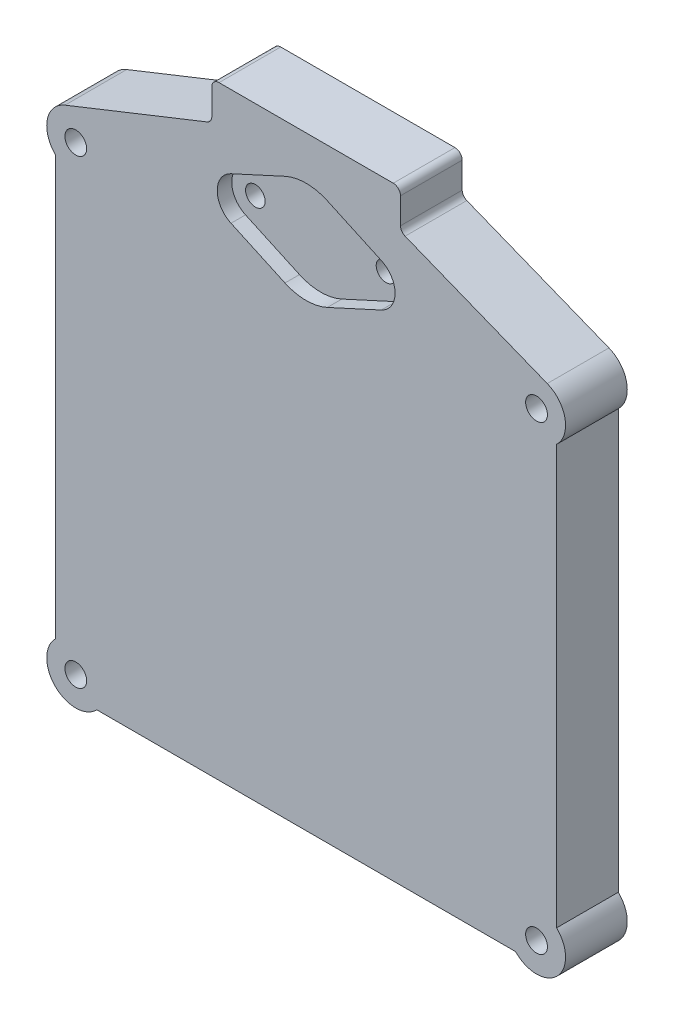
ISO-10303-21;
HEADER;
FILE_DESCRIPTION(('STEP AP214'),'2;1');
FILE_NAME('part.step','',(''),(''),'','','');
FILE_SCHEMA(('AUTOMOTIVE_DESIGN { 1 0 10303 214 1 1 1 1 }'));
ENDSEC;
DATA;
#1=APPLICATION_CONTEXT('core data for automotive mechanical design processes');
#2=APPLICATION_PROTOCOL_DEFINITION('international standard','automotive_design',2000,#1);
#3=PRODUCT_CONTEXT('',#1,'mechanical');
#4=PRODUCT('Part','Part','',(#3));
#5=PRODUCT_RELATED_PRODUCT_CATEGORY('part','',(#4));
#6=PRODUCT_DEFINITION_FORMATION('','',#4);
#7=PRODUCT_DEFINITION_CONTEXT('part definition',#1,'design');
#8=PRODUCT_DEFINITION('design','',#6,#7);
#9=PRODUCT_DEFINITION_SHAPE('','',#8);
#10=(LENGTH_UNIT() NAMED_UNIT(*) SI_UNIT(.MILLI.,.METRE.));
#11=(NAMED_UNIT(*) PLANE_ANGLE_UNIT() SI_UNIT($,.RADIAN.));
#12=(NAMED_UNIT(*) SI_UNIT($,.STERADIAN.) SOLID_ANGLE_UNIT());
#13=UNCERTAINTY_MEASURE_WITH_UNIT(LENGTH_MEASURE(1.E-05),#10,'distance_accuracy_value','');
#14=(GEOMETRIC_REPRESENTATION_CONTEXT(3) GLOBAL_UNCERTAINTY_ASSIGNED_CONTEXT((#13)) GLOBAL_UNIT_ASSIGNED_CONTEXT((#10,
#11,#12)) REPRESENTATION_CONTEXT('',''));
#15=CARTESIAN_POINT('',(0.,0.,0.));
#16=DIRECTION('',(0.,0.,1.));
#17=DIRECTION('',(1.,0.,0.));
#18=AXIS2_PLACEMENT_3D('',#15,#16,#17);
#19=CARTESIAN_POINT('',(-63.4748737341536,-63.4748737341526,17.));
#20=DIRECTION('',(0.,0.,-1.));
#21=DIRECTION('',(-1.,0.,0.));
#22=AXIS2_PLACEMENT_3D('',#19,#20,#21);
#23=CYLINDRICAL_SURFACE('',#22,8.);
#24=CARTESIAN_POINT('',(-63.4748737341536,-63.4748737341526,0.));
#25=DIRECTION('',(0.,0.,1.));
#26=DIRECTION('',(1.,0.,0.));
#27=AXIS2_PLACEMENT_3D('',#24,#25,#26);
#28=CIRCLE('',#27,8.);
#29=CARTESIAN_POINT('',(-69.0000000000019,-57.6892899480138,0.));
#30=VERTEX_POINT('',#29);
#31=CARTESIAN_POINT('',(-57.6892899480158,-69.0000000000021,0.));
#32=VERTEX_POINT('',#31);
#33=EDGE_CURVE('E358',#30,#32,#28,.T.);
#34=ORIENTED_EDGE('',*,*,#33,.T.);
#35=DIRECTION('',(0.,0.,-1.));
#36=VECTOR('',#35,1.);
#37=CARTESIAN_POINT('',(-57.6892899480158,-69.0000000000021,17.));
#38=LINE('',#37,#36);
#39=CARTESIAN_POINT('',(-57.6892899480158,-69.0000000000021,17.));
#40=VERTEX_POINT('',#39);
#41=EDGE_CURVE('E12',#40,#32,#38,.T.);
#42=ORIENTED_EDGE('',*,*,#41,.F.);
#43=CARTESIAN_POINT('',(-63.4748737341536,-63.4748737341526,17.));
#44=DIRECTION('',(0.,0.,1.));
#45=DIRECTION('',(1.,0.,0.));
#46=AXIS2_PLACEMENT_3D('',#43,#44,#45);
#47=CIRCLE('',#46,8.);
#48=CARTESIAN_POINT('',(-69.0000000000019,-57.6892899480138,17.));
#49=VERTEX_POINT('',#48);
#50=EDGE_CURVE('E307',#49,#40,#47,.T.);
#51=ORIENTED_EDGE('',*,*,#50,.F.);
#52=DIRECTION('',(0.,0.,-1.));
#53=VECTOR('',#52,1.);
#54=CARTESIAN_POINT('',(-69.0000000000019,-57.6892899480138,17.));
#55=LINE('',#54,#53);
#56=EDGE_CURVE('E205',#49,#30,#55,.T.);
#57=ORIENTED_EDGE('',*,*,#56,.T.);
#58=EDGE_LOOP('',(#34,#42,#51,#57));
#59=FACE_BOUND('',#58,.T.);
#60=ADVANCED_FACE('F48',(#59),#23,.T.);
#61=CARTESIAN_POINT('',(-57.6892899480158,-69.0000000000021,17.));
#62=DIRECTION('',(0.,1.,0.));
#63=DIRECTION('',(0.,0.,1.));
#64=AXIS2_PLACEMENT_3D('',#61,#62,#63);
#65=PLANE('',#64);
#66=DIRECTION('',(1.,0.,0.));
#67=VECTOR('',#66,1.);
#68=CARTESIAN_POINT('',(-57.6892899480158,-69.0000000000021,0.));
#69=LINE('',#68,#67);
#70=CARTESIAN_POINT('',(57.6892899480148,-69.0000000000021,0.));
#71=VERTEX_POINT('',#70);
#72=EDGE_CURVE('E349',#32,#71,#69,.T.);
#73=ORIENTED_EDGE('',*,*,#72,.T.);
#74=DIRECTION('',(0.,0.,-1.));
#75=VECTOR('',#74,1.);
#76=CARTESIAN_POINT('',(57.6892899480148,-69.0000000000021,17.));
#77=LINE('',#76,#75);
#78=CARTESIAN_POINT('',(57.6892899480148,-69.0000000000021,17.));
#79=VERTEX_POINT('',#78);
#80=EDGE_CURVE('E56',#79,#71,#77,.T.);
#81=ORIENTED_EDGE('',*,*,#80,.F.);
#82=DIRECTION('',(1.,0.,0.));
#83=VECTOR('',#82,1.);
#84=CARTESIAN_POINT('',(-57.6892899480158,-69.0000000000021,17.));
#85=LINE('',#84,#83);
#86=EDGE_CURVE('E137',#40,#79,#85,.T.);
#87=ORIENTED_EDGE('',*,*,#86,.F.);
#88=ORIENTED_EDGE('',*,*,#41,.T.);
#89=EDGE_LOOP('',(#73,#81,#87,#88));
#90=FACE_BOUND('',#89,.T.);
#91=ADVANCED_FACE('F510',(#90),#65,.F.);
#92=CARTESIAN_POINT('',(63.4748737341521,-63.4748737341521,17.));
#93=DIRECTION('',(0.,0.,-1.));
#94=DIRECTION('',(-1.,0.,0.));
#95=AXIS2_PLACEMENT_3D('',#92,#93,#94);
#96=CYLINDRICAL_SURFACE('',#95,8.);
#97=CARTESIAN_POINT('',(63.4748737341521,-63.4748737341521,0.));
#98=DIRECTION('',(0.,0.,1.));
#99=DIRECTION('',(1.,0.,0.));
#100=AXIS2_PLACEMENT_3D('',#97,#98,#99);
#101=CIRCLE('',#100,8.);
#102=CARTESIAN_POINT('',(68.9999999999982,-57.6892899480111,0.));
#103=VERTEX_POINT('',#102);
#104=EDGE_CURVE('E344',#71,#103,#101,.T.);
#105=ORIENTED_EDGE('',*,*,#104,.T.);
#106=DIRECTION('',(0.,0.,-1.));
#107=VECTOR('',#106,1.);
#108=CARTESIAN_POINT('',(68.9999999999982,-57.6892899480111,17.));
#109=LINE('',#108,#107);
#110=CARTESIAN_POINT('',(68.9999999999982,-57.6892899480111,17.));
#111=VERTEX_POINT('',#110);
#112=EDGE_CURVE('E334',#111,#103,#109,.T.);
#113=ORIENTED_EDGE('',*,*,#112,.F.);
#114=CARTESIAN_POINT('',(63.4748737341521,-63.4748737341521,17.));
#115=DIRECTION('',(0.,0.,1.));
#116=DIRECTION('',(1.,0.,0.));
#117=AXIS2_PLACEMENT_3D('',#114,#115,#116);
#118=CIRCLE('',#117,8.);
#119=EDGE_CURVE('E296',#79,#111,#118,.T.);
#120=ORIENTED_EDGE('',*,*,#119,.F.);
#121=ORIENTED_EDGE('',*,*,#80,.T.);
#122=EDGE_LOOP('',(#105,#113,#120,#121));
#123=FACE_BOUND('',#122,.T.);
#124=ADVANCED_FACE('F342',(#123),#96,.T.);
#125=CARTESIAN_POINT('',(68.9999999999982,-57.6892899480111,17.));
#126=DIRECTION('',(-1.,0.,0.));
#127=DIRECTION('',(0.,0.,1.));
#128=AXIS2_PLACEMENT_3D('',#125,#126,#127);
#129=PLANE('',#128);
#130=DIRECTION('',(0.,1.,0.));
#131=VECTOR('',#130,1.);
#132=CARTESIAN_POINT('',(68.9999999999982,-57.6892899480111,0.));
#133=LINE('',#132,#131);
#134=CARTESIAN_POINT('',(68.9999999999982,57.6892899480075,0.));
#135=VERTEX_POINT('',#134);
#136=EDGE_CURVE('E351',#103,#135,#133,.T.);
#137=ORIENTED_EDGE('',*,*,#136,.T.);
#138=DIRECTION('',(0.,0.,-1.));
#139=VECTOR('',#138,1.);
#140=CARTESIAN_POINT('',(68.9999999999982,57.6892899480075,17.));
#141=LINE('',#140,#139);
#142=CARTESIAN_POINT('',(68.9999999999982,57.6892899480075,17.));
#143=VERTEX_POINT('',#142);
#144=EDGE_CURVE('E327',#143,#135,#141,.T.);
#145=ORIENTED_EDGE('',*,*,#144,.F.);
#146=DIRECTION('',(0.,1.,0.));
#147=VECTOR('',#146,1.);
#148=CARTESIAN_POINT('',(68.9999999999982,-57.6892899480111,17.));
#149=LINE('',#148,#147);
#150=EDGE_CURVE('E291',#111,#143,#149,.T.);
#151=ORIENTED_EDGE('',*,*,#150,.F.);
#152=ORIENTED_EDGE('',*,*,#112,.T.);
#153=EDGE_LOOP('',(#137,#145,#151,#152));
#154=FACE_BOUND('',#153,.T.);
#155=ADVANCED_FACE('F700',(#154),#129,.F.);
#156=CARTESIAN_POINT('',(63.4748737341545,63.4748737341509,17.));
#157=DIRECTION('',(0.,0.,-1.));
#158=DIRECTION('',(-1.,0.,0.));
#159=AXIS2_PLACEMENT_3D('',#156,#157,#158);
#160=CYLINDRICAL_SURFACE('',#159,8.);
#161=CARTESIAN_POINT('',(63.4748737341545,63.4748737341509,0.));
#162=DIRECTION('',(0.,0.,1.));
#163=DIRECTION('',(1.,0.,0.));
#164=AXIS2_PLACEMENT_3D('',#161,#162,#163);
#165=CIRCLE('',#164,8.);
#166=CARTESIAN_POINT('',(66.4312611081222,70.9085655286124,0.));
#167=VERTEX_POINT('',#166);
#168=EDGE_CURVE('E356',#135,#167,#165,.T.);
#169=ORIENTED_EDGE('',*,*,#168,.T.);
#170=DIRECTION('',(0.,0.,-1.));
#171=VECTOR('',#170,1.);
#172=CARTESIAN_POINT('',(66.4312611081222,70.9085655286124,17.));
#173=LINE('',#172,#171);
#174=CARTESIAN_POINT('',(66.4312611081222,70.9085655286124,17.));
#175=VERTEX_POINT('',#174);
#176=EDGE_CURVE('E321',#175,#167,#173,.T.);
#177=ORIENTED_EDGE('',*,*,#176,.F.);
#178=CARTESIAN_POINT('',(63.4748737341545,63.4748737341509,17.));
#179=DIRECTION('',(0.,0.,1.));
#180=DIRECTION('',(1.,0.,0.));
#181=AXIS2_PLACEMENT_3D('',#178,#179,#180);
#182=CIRCLE('',#181,8.);
#183=EDGE_CURVE('E287',#143,#175,#182,.T.);
#184=ORIENTED_EDGE('',*,*,#183,.F.);
#185=ORIENTED_EDGE('',*,*,#144,.T.);
#186=EDGE_LOOP('',(#169,#177,#184,#185));
#187=FACE_BOUND('',#186,.T.);
#188=ADVANCED_FACE('F664',(#187),#160,.T.);
#189=CARTESIAN_POINT('',(27.2609031565084,86.4866598166083,17.));
#190=DIRECTION('',(-0.369548421746173,-0.929211474307605,0.));
#191=DIRECTION('',(0.929211474307605,-0.369548421746173,0.));
#192=AXIS2_PLACEMENT_3D('',#189,#190,#191);
#193=PLANE('',#192);
#194=DIRECTION('',(-0.929211474307605,0.369548421746173,0.));
#195=VECTOR('',#194,1.);
#196=CARTESIAN_POINT('',(27.2609031565084,86.4866598166083,0.));
#197=LINE('',#196,#195);
#198=CARTESIAN_POINT('',(27.2609031565084,86.4866598166083,0.));
#199=VERTEX_POINT('',#198);
#200=EDGE_CURVE('E226',#167,#199,#197,.T.);
#201=ORIENTED_EDGE('',*,*,#200,.T.);
#202=DIRECTION('',(0.,0.,-1.));
#203=VECTOR('',#202,1.);
#204=CARTESIAN_POINT('',(27.2609031565084,86.4866598166083,17.));
#205=LINE('',#204,#203);
#206=CARTESIAN_POINT('',(27.2609031565084,86.4866598166083,17.));
#207=VERTEX_POINT('',#206);
#208=EDGE_CURVE('E328',#207,#199,#205,.T.);
#209=ORIENTED_EDGE('',*,*,#208,.F.);
#210=DIRECTION('',(-0.929211474307605,0.369548421746173,0.));
#211=VECTOR('',#210,1.);
#212=CARTESIAN_POINT('',(27.2609031565084,86.4866598166083,17.));
#213=LINE('',#212,#211);
#214=EDGE_CURVE('E249',#175,#207,#213,.T.);
#215=ORIENTED_EDGE('',*,*,#214,.F.);
#216=ORIENTED_EDGE('',*,*,#176,.T.);
#217=EDGE_LOOP('',(#201,#209,#215,#216));
#218=FACE_BOUND('',#217,.T.);
#219=ADVANCED_FACE('F368',(#218),#193,.F.);
#220=CARTESIAN_POINT('',(28.0000000000007,88.3450827652235,17.));
#221=DIRECTION('',(0.,0.,-1.));
#222=DIRECTION('',(-1.,0.,0.));
#223=AXIS2_PLACEMENT_3D('',#220,#221,#222);
#224=CYLINDRICAL_SURFACE('',#223,2.);
#225=CARTESIAN_POINT('',(28.0000000000007,88.3450827652235,0.));
#226=DIRECTION('',(0.,0.,-1.));
#227=DIRECTION('',(1.,0.,0.));
#228=AXIS2_PLACEMENT_3D('',#225,#226,#227);
#229=CIRCLE('',#228,2.);
#230=CARTESIAN_POINT('',(26.0000000000007,88.3450827652234,0.));
#231=VERTEX_POINT('',#230);
#232=EDGE_CURVE('E220',#199,#231,#229,.T.);
#233=ORIENTED_EDGE('',*,*,#232,.T.);
#234=DIRECTION('',(0.,0.,-1.));
#235=VECTOR('',#234,1.);
#236=CARTESIAN_POINT('',(26.0000000000007,88.3450827652234,17.));
#237=LINE('',#236,#235);
#238=CARTESIAN_POINT('',(26.0000000000007,88.3450827652234,17.));
#239=VERTEX_POINT('',#238);
#240=EDGE_CURVE('E376',#239,#231,#237,.T.);
#241=ORIENTED_EDGE('',*,*,#240,.F.);
#242=CARTESIAN_POINT('',(28.0000000000007,88.3450827652235,17.));
#243=DIRECTION('',(0.,0.,-1.));
#244=DIRECTION('',(1.,0.,0.));
#245=AXIS2_PLACEMENT_3D('',#242,#243,#244);
#246=CIRCLE('',#245,2.);
#247=EDGE_CURVE('E244',#207,#239,#246,.T.);
#248=ORIENTED_EDGE('',*,*,#247,.F.);
#249=ORIENTED_EDGE('',*,*,#208,.T.);
#250=EDGE_LOOP('',(#233,#241,#248,#249));
#251=FACE_BOUND('',#250,.T.);
#252=ADVANCED_FACE('F372',(#251),#224,.F.);
#253=CARTESIAN_POINT('',(26.0000000000007,88.3450827652234,17.));
#254=DIRECTION('',(-1.,0.,0.));
#255=DIRECTION('',(0.,0.,1.));
#256=AXIS2_PLACEMENT_3D('',#253,#254,#255);
#257=PLANE('',#256);
#258=DIRECTION('',(0.,1.,0.));
#259=VECTOR('',#258,1.);
#260=CARTESIAN_POINT('',(26.0000000000007,88.3450827652234,0.));
#261=LINE('',#260,#259);
#262=CARTESIAN_POINT('',(26.0000000000007,95.4999999999998,0.));
#263=VERTEX_POINT('',#262);
#264=EDGE_CURVE('E225',#231,#263,#261,.T.);
#265=ORIENTED_EDGE('',*,*,#264,.T.);
#266=DIRECTION('',(0.,0.,-1.));
#267=VECTOR('',#266,1.);
#268=CARTESIAN_POINT('',(26.0000000000007,95.4999999999998,17.));
#269=LINE('',#268,#267);
#270=CARTESIAN_POINT('',(26.0000000000007,95.4999999999998,17.));
#271=VERTEX_POINT('',#270);
#272=EDGE_CURVE('E385',#271,#263,#269,.T.);
#273=ORIENTED_EDGE('',*,*,#272,.F.);
#274=DIRECTION('',(0.,1.,0.));
#275=VECTOR('',#274,1.);
#276=CARTESIAN_POINT('',(26.0000000000007,88.3450827652234,17.));
#277=LINE('',#276,#275);
#278=EDGE_CURVE('E248',#239,#271,#277,.T.);
#279=ORIENTED_EDGE('',*,*,#278,.F.);
#280=ORIENTED_EDGE('',*,*,#240,.T.);
#281=EDGE_LOOP('',(#265,#273,#279,#280));
#282=FACE_BOUND('',#281,.T.);
#283=ADVANCED_FACE('F383',(#282),#257,.F.);
#284=CARTESIAN_POINT('',(24.0000000000007,95.4999999999998,17.));
#285=DIRECTION('',(0.,0.,-1.));
#286=DIRECTION('',(-1.,0.,0.));
#287=AXIS2_PLACEMENT_3D('',#284,#285,#286);
#288=CYLINDRICAL_SURFACE('',#287,2.);
#289=CARTESIAN_POINT('',(24.0000000000007,95.4999999999998,0.));
#290=DIRECTION('',(0.,0.,1.));
#291=DIRECTION('',(1.,0.,0.));
#292=AXIS2_PLACEMENT_3D('',#289,#290,#291);
#293=CIRCLE('',#292,2.);
#294=CARTESIAN_POINT('',(24.0000000000005,97.4999999999998,0.));
#295=VERTEX_POINT('',#294);
#296=EDGE_CURVE('E232',#263,#295,#293,.T.);
#297=ORIENTED_EDGE('',*,*,#296,.T.);
#298=DIRECTION('',(0.,0.,-1.));
#299=VECTOR('',#298,1.);
#300=CARTESIAN_POINT('',(24.0000000000005,97.4999999999998,17.));
#301=LINE('',#300,#299);
#302=CARTESIAN_POINT('',(24.0000000000005,97.4999999999998,17.));
#303=VERTEX_POINT('',#302);
#304=EDGE_CURVE('E391',#303,#295,#301,.T.);
#305=ORIENTED_EDGE('',*,*,#304,.F.);
#306=CARTESIAN_POINT('',(24.0000000000007,95.4999999999998,17.));
#307=DIRECTION('',(0.,0.,1.));
#308=DIRECTION('',(1.,0.,0.));
#309=AXIS2_PLACEMENT_3D('',#306,#307,#308);
#310=CIRCLE('',#309,2.);
#311=EDGE_CURVE('E255',#271,#303,#310,.T.);
#312=ORIENTED_EDGE('',*,*,#311,.F.);
#313=ORIENTED_EDGE('',*,*,#272,.T.);
#314=EDGE_LOOP('',(#297,#305,#312,#313));
#315=FACE_BOUND('',#314,.T.);
#316=ADVANCED_FACE('F388',(#315),#288,.T.);
#317=CARTESIAN_POINT('',(-23.9999999999995,97.4999999999998,17.));
#318=DIRECTION('',(0.,-1.,0.));
#319=DIRECTION('',(0.,0.,-1.));
#320=AXIS2_PLACEMENT_3D('',#317,#318,#319);
#321=PLANE('',#320);
#322=DIRECTION('',(-1.,0.,0.));
#323=VECTOR('',#322,1.);
#324=CARTESIAN_POINT('',(-23.9999999999995,97.4999999999998,0.));
#325=LINE('',#324,#323);
#326=CARTESIAN_POINT('',(-23.9999999999995,97.4999999999998,0.));
#327=VERTEX_POINT('',#326);
#328=EDGE_CURVE('E413',#295,#327,#325,.T.);
#329=ORIENTED_EDGE('',*,*,#328,.T.);
#330=DIRECTION('',(0.,0.,-1.));
#331=VECTOR('',#330,1.);
#332=CARTESIAN_POINT('',(-23.9999999999995,97.4999999999998,17.));
#333=LINE('',#332,#331);
#334=CARTESIAN_POINT('',(-23.9999999999995,97.4999999999998,17.));
#335=VERTEX_POINT('',#334);
#336=EDGE_CURVE('E394',#335,#327,#333,.T.);
#337=ORIENTED_EDGE('',*,*,#336,.F.);
#338=DIRECTION('',(-1.,0.,0.));
#339=VECTOR('',#338,1.);
#340=CARTESIAN_POINT('',(-23.9999999999995,97.4999999999998,17.));
#341=LINE('',#340,#339);
#342=EDGE_CURVE('E259',#303,#335,#341,.T.);
#343=ORIENTED_EDGE('',*,*,#342,.F.);
#344=ORIENTED_EDGE('',*,*,#304,.T.);
#345=EDGE_LOOP('',(#329,#337,#343,#344));
#346=FACE_BOUND('',#345,.T.);
#347=ADVANCED_FACE('F677',(#346),#321,.F.);
#348=CARTESIAN_POINT('',(-23.9999999999993,95.4999999999998,17.));
#349=DIRECTION('',(0.,0.,-1.));
#350=DIRECTION('',(-1.,0.,0.));
#351=AXIS2_PLACEMENT_3D('',#348,#349,#350);
#352=CYLINDRICAL_SURFACE('',#351,2.);
#353=CARTESIAN_POINT('',(-23.9999999999993,95.4999999999998,0.));
#354=DIRECTION('',(0.,0.,1.));
#355=DIRECTION('',(1.,0.,0.));
#356=AXIS2_PLACEMENT_3D('',#353,#354,#355);
#357=CIRCLE('',#356,2.);
#358=CARTESIAN_POINT('',(-25.9999999999993,95.4999999999998,0.));
#359=VERTEX_POINT('',#358);
#360=EDGE_CURVE('E408',#327,#359,#357,.T.);
#361=ORIENTED_EDGE('',*,*,#360,.T.);
#362=DIRECTION('',(0.,0.,-1.));
#363=VECTOR('',#362,1.);
#364=CARTESIAN_POINT('',(-25.9999999999993,95.4999999999998,17.));
#365=LINE('',#364,#363);
#366=CARTESIAN_POINT('',(-25.9999999999993,95.4999999999998,17.));
#367=VERTEX_POINT('',#366);
#368=EDGE_CURVE('E534',#367,#359,#365,.T.);
#369=ORIENTED_EDGE('',*,*,#368,.F.);
#370=CARTESIAN_POINT('',(-23.9999999999993,95.4999999999998,17.));
#371=DIRECTION('',(0.,0.,1.));
#372=DIRECTION('',(1.,0.,0.));
#373=AXIS2_PLACEMENT_3D('',#370,#371,#372);
#374=CIRCLE('',#373,2.);
#375=EDGE_CURVE('E269',#335,#367,#374,.T.);
#376=ORIENTED_EDGE('',*,*,#375,.F.);
#377=ORIENTED_EDGE('',*,*,#336,.T.);
#378=EDGE_LOOP('',(#361,#369,#376,#377));
#379=FACE_BOUND('',#378,.T.);
#380=ADVANCED_FACE('F545',(#379),#352,.T.);
#381=CARTESIAN_POINT('',(-25.9999999999996,88.3450827652236,17.));
#382=DIRECTION('',(1.,0.,0.));
#383=DIRECTION('',(0.,1.,0.));
#384=AXIS2_PLACEMENT_3D('',#381,#382,#383);
#385=PLANE('',#384);
#386=DIRECTION('',(0.,-1.,0.));
#387=VECTOR('',#386,1.);
#388=CARTESIAN_POINT('',(-25.9999999999996,88.3450827652236,0.));
#389=LINE('',#388,#387);
#390=CARTESIAN_POINT('',(-25.9999999999996,88.3450827652236,0.));
#391=VERTEX_POINT('',#390);
#392=EDGE_CURVE('E412',#359,#391,#389,.T.);
#393=ORIENTED_EDGE('',*,*,#392,.T.);
#394=DIRECTION('',(0.,0.,-1.));
#395=VECTOR('',#394,1.);
#396=CARTESIAN_POINT('',(-25.9999999999996,88.3450827652236,17.));
#397=LINE('',#396,#395);
#398=CARTESIAN_POINT('',(-25.9999999999996,88.3450827652236,17.));
#399=VERTEX_POINT('',#398);
#400=EDGE_CURVE('E530',#399,#391,#397,.T.);
#401=ORIENTED_EDGE('',*,*,#400,.F.);
#402=DIRECTION('',(0.,-1.,0.));
#403=VECTOR('',#402,1.);
#404=CARTESIAN_POINT('',(-25.9999999999996,88.3450827652236,17.));
#405=LINE('',#404,#403);
#406=EDGE_CURVE('E272',#367,#399,#405,.T.);
#407=ORIENTED_EDGE('',*,*,#406,.F.);
#408=ORIENTED_EDGE('',*,*,#368,.T.);
#409=EDGE_LOOP('',(#393,#401,#407,#408));
#410=FACE_BOUND('',#409,.T.);
#411=ADVANCED_FACE('F553',(#410),#385,.F.);
#412=CARTESIAN_POINT('',(-27.9999999999995,88.3450827652234,17.));
#413=DIRECTION('',(0.,0.,-1.));
#414=DIRECTION('',(-1.,0.,0.));
#415=AXIS2_PLACEMENT_3D('',#412,#413,#414);
#416=CYLINDRICAL_SURFACE('',#415,1.99999999999999);
#417=CARTESIAN_POINT('',(-27.9999999999995,88.3450827652234,0.));
#418=DIRECTION('',(0.,0.,-1.));
#419=DIRECTION('',(1.,0.,0.));
#420=AXIS2_PLACEMENT_3D('',#417,#418,#419);
#421=CIRCLE('',#420,1.99999999999999);
#422=CARTESIAN_POINT('',(-27.2609031565071,86.4866598166083,0.));
#423=VERTEX_POINT('',#422);
#424=EDGE_CURVE('E417',#391,#423,#421,.T.);
#425=ORIENTED_EDGE('',*,*,#424,.T.);
#426=DIRECTION('',(0.,0.,-1.));
#427=VECTOR('',#426,1.);
#428=CARTESIAN_POINT('',(-27.2609031565071,86.4866598166083,17.));
#429=LINE('',#428,#427);
#430=CARTESIAN_POINT('',(-27.2609031565071,86.4866598166083,17.));
#431=VERTEX_POINT('',#430);
#432=EDGE_CURVE('E198',#431,#423,#429,.T.);
#433=ORIENTED_EDGE('',*,*,#432,.F.);
#434=CARTESIAN_POINT('',(-27.9999999999995,88.3450827652234,17.));
#435=DIRECTION('',(0.,0.,-1.));
#436=DIRECTION('',(1.,0.,0.));
#437=AXIS2_PLACEMENT_3D('',#434,#435,#436);
#438=CIRCLE('',#437,1.99999999999999);
#439=EDGE_CURVE('E184',#399,#431,#438,.T.);
#440=ORIENTED_EDGE('',*,*,#439,.F.);
#441=ORIENTED_EDGE('',*,*,#400,.T.);
#442=EDGE_LOOP('',(#425,#433,#440,#441));
#443=FACE_BOUND('',#442,.T.);
#444=ADVANCED_FACE('F556',(#443),#416,.F.);
#445=CARTESIAN_POINT('',(-27.2609031565071,86.4866598166083,17.));
#446=DIRECTION('',(0.369548421746161,-0.92921147430761,0.));
#447=DIRECTION('',(0.92921147430761,0.369548421746161,0.));
#448=AXIS2_PLACEMENT_3D('',#445,#446,#447);
#449=PLANE('',#448);
#450=DIRECTION('',(-0.92921147430761,-0.369548421746161,0.));
#451=VECTOR('',#450,1.);
#452=CARTESIAN_POINT('',(-27.2609031565071,86.4866598166083,0.));
#453=LINE('',#452,#451);
#454=CARTESIAN_POINT('',(-66.4312611081239,70.9085655286118,0.));
#455=VERTEX_POINT('',#454);
#456=EDGE_CURVE('E194',#423,#455,#453,.T.);
#457=ORIENTED_EDGE('',*,*,#456,.T.);
#458=DIRECTION('',(0.,0.,-1.));
#459=VECTOR('',#458,1.);
#460=CARTESIAN_POINT('',(-66.4312611081239,70.9085655286118,17.));
#461=LINE('',#460,#459);
#462=CARTESIAN_POINT('',(-66.4312611081239,70.9085655286118,17.));
#463=VERTEX_POINT('',#462);
#464=EDGE_CURVE('E191',#463,#455,#461,.T.);
#465=ORIENTED_EDGE('',*,*,#464,.F.);
#466=DIRECTION('',(-0.92921147430761,-0.369548421746161,0.));
#467=VECTOR('',#466,1.);
#468=CARTESIAN_POINT('',(-27.2609031565071,86.4866598166083,17.));
#469=LINE('',#468,#467);
#470=EDGE_CURVE('E177',#431,#463,#469,.T.);
#471=ORIENTED_EDGE('',*,*,#470,.F.);
#472=ORIENTED_EDGE('',*,*,#432,.T.);
#473=EDGE_LOOP('',(#457,#465,#471,#472));
#474=FACE_BOUND('',#473,.T.);
#475=ADVANCED_FACE('F192',(#474),#449,.F.);
#476=CARTESIAN_POINT('',(-63.4748737341545,63.474873734151,17.));
#477=DIRECTION('',(0.,0.,-1.));
#478=DIRECTION('',(-1.,0.,0.));
#479=AXIS2_PLACEMENT_3D('',#476,#477,#478);
#480=CYLINDRICAL_SURFACE('',#479,8.);
#481=CARTESIAN_POINT('',(-63.4748737341545,63.474873734151,0.));
#482=DIRECTION('',(0.,0.,1.));
#483=DIRECTION('',(1.,0.,0.));
#484=AXIS2_PLACEMENT_3D('',#481,#482,#483);
#485=CIRCLE('',#484,8.);
#486=CARTESIAN_POINT('',(-69.0000000000019,57.6892899480113,0.));
#487=VERTEX_POINT('',#486);
#488=EDGE_CURVE('E517',#455,#487,#485,.T.);
#489=ORIENTED_EDGE('',*,*,#488,.T.);
#490=DIRECTION('',(0.,0.,-1.));
#491=VECTOR('',#490,1.);
#492=CARTESIAN_POINT('',(-69.0000000000019,57.6892899480113,17.));
#493=LINE('',#492,#491);
#494=CARTESIAN_POINT('',(-69.0000000000019,57.6892899480113,17.));
#495=VERTEX_POINT('',#494);
#496=EDGE_CURVE('E199',#495,#487,#493,.T.);
#497=ORIENTED_EDGE('',*,*,#496,.F.);
#498=CARTESIAN_POINT('',(-63.4748737341545,63.474873734151,17.));
#499=DIRECTION('',(0.,0.,1.));
#500=DIRECTION('',(1.,0.,0.));
#501=AXIS2_PLACEMENT_3D('',#498,#499,#500);
#502=CIRCLE('',#501,8.);
#503=EDGE_CURVE('E181',#463,#495,#502,.T.);
#504=ORIENTED_EDGE('',*,*,#503,.F.);
#505=ORIENTED_EDGE('',*,*,#464,.T.);
#506=EDGE_LOOP('',(#489,#497,#504,#505));
#507=FACE_BOUND('',#506,.T.);
#508=ADVANCED_FACE('F201',(#507),#480,.T.);
#509=CARTESIAN_POINT('',(-69.0000000000019,57.6892899480113,17.));
#510=DIRECTION('',(1.,0.,0.));
#511=DIRECTION('',(0.,0.,-1.));
#512=AXIS2_PLACEMENT_3D('',#509,#510,#511);
#513=PLANE('',#512);
#514=DIRECTION('',(0.,-1.,0.));
#515=VECTOR('',#514,1.);
#516=CARTESIAN_POINT('',(-69.0000000000019,57.6892899480113,0.));
#517=LINE('',#516,#515);
#518=EDGE_CURVE('E129',#487,#30,#517,.T.);
#519=ORIENTED_EDGE('',*,*,#518,.T.);
#520=ORIENTED_EDGE('',*,*,#56,.F.);
#521=DIRECTION('',(0.,-1.,0.));
#522=VECTOR('',#521,1.);
#523=CARTESIAN_POINT('',(-69.0000000000019,57.6892899480113,17.));
#524=LINE('',#523,#522);
#525=EDGE_CURVE('E72',#495,#49,#524,.T.);
#526=ORIENTED_EDGE('',*,*,#525,.F.);
#527=ORIENTED_EDGE('',*,*,#496,.T.);
#528=EDGE_LOOP('',(#519,#520,#526,#527));
#529=FACE_BOUND('',#528,.T.);
#530=ADVANCED_FACE('F497',(#529),#513,.F.);
#531=CARTESIAN_POINT('',(-63.4748737341536,-63.4748737341526,17.));
#532=DIRECTION('',(0.,0.,1.));
#533=DIRECTION('',(1.,0.,0.));
#534=AXIS2_PLACEMENT_3D('',#531,#532,#533);
#535=PLANE('',#534);
#536=DIRECTION('',(0.909059342886304,-0.416666666666678,0.));
#537=VECTOR('',#536,1.);
#538=CARTESIAN_POINT('',(-20.7083333333336,65.5911142712389,17.));
#539=LINE('',#538,#537);
#540=CARTESIAN_POINT('',(-20.7083333333336,65.5911142712389,17.));
#541=VERTEX_POINT('',#540);
#542=CARTESIAN_POINT('',(-5.83333333333313,58.773169199591,17.));
#543=VERTEX_POINT('',#542);
#544=EDGE_CURVE('E63',#541,#543,#539,.T.);
#545=ORIENTED_EDGE('',*,*,#544,.F.);
#546=CARTESIAN_POINT('',(-17.9999999999998,71.4999999999997,17.));
#547=DIRECTION('',(0.,0.,1.));
#548=DIRECTION('',(1.,0.,0.));
#549=AXIS2_PLACEMENT_3D('',#546,#547,#548);
#550=CIRCLE('',#549,6.5);
#551=CARTESIAN_POINT('',(-20.7083333333336,77.4088857287605,17.));
#552=VERTEX_POINT('',#551);
#553=EDGE_CURVE('E775',#552,#541,#550,.T.);
#554=ORIENTED_EDGE('',*,*,#553,.F.);
#555=DIRECTION('',(-0.909059342886312,-0.416666666666661,0.));
#556=VECTOR('',#555,1.);
#557=CARTESIAN_POINT('',(-20.7083333333336,77.4088857287605,17.));
#558=LINE('',#557,#556);
#559=CARTESIAN_POINT('',(-5.83333333333414,84.2268308004074,17.));
#560=VERTEX_POINT('',#559);
#561=EDGE_CURVE('E779',#560,#552,#558,.T.);
#562=ORIENTED_EDGE('',*,*,#561,.F.);
#563=CARTESIAN_POINT('',(0.,71.4999999999995,17.));
#564=DIRECTION('',(0.,0.,1.));
#565=DIRECTION('',(1.,0.,0.));
#566=AXIS2_PLACEMENT_3D('',#563,#564,#565);
#567=CIRCLE('',#566,13.9999999999999);
#568=CARTESIAN_POINT('',(5.83333333333346,84.2268308004079,17.));
#569=VERTEX_POINT('',#568);
#570=EDGE_CURVE('E783',#569,#560,#567,.T.);
#571=ORIENTED_EDGE('',*,*,#570,.F.);
#572=DIRECTION('',(-0.909059342886314,0.416666666666656,0.));
#573=VECTOR('',#572,1.);
#574=CARTESIAN_POINT('',(20.7083333333343,77.4088857287605,17.));
#575=LINE('',#574,#573);
#576=CARTESIAN_POINT('',(20.7083333333343,77.4088857287605,17.));
#577=VERTEX_POINT('',#576);
#578=EDGE_CURVE('E787',#577,#569,#575,.T.);
#579=ORIENTED_EDGE('',*,*,#578,.F.);
#580=CARTESIAN_POINT('',(18.0000000000005,71.4999999999997,17.));
#581=DIRECTION('',(0.,0.,1.));
#582=DIRECTION('',(1.,0.,0.));
#583=AXIS2_PLACEMENT_3D('',#580,#581,#582);
#584=CIRCLE('',#583,6.5);
#585=CARTESIAN_POINT('',(20.7083333333343,65.5911142712389,17.));
#586=VERTEX_POINT('',#585);
#587=EDGE_CURVE('E791',#586,#577,#584,.T.);
#588=ORIENTED_EDGE('',*,*,#587,.F.);
#589=DIRECTION('',(0.909059342886307,0.416666666666673,0.));
#590=VECTOR('',#589,1.);
#591=CARTESIAN_POINT('',(20.7083333333343,65.5911142712389,17.));
#592=LINE('',#591,#590);
#593=CARTESIAN_POINT('',(5.83333333333499,58.7731691995918,17.));
#594=VERTEX_POINT('',#593);
#595=EDGE_CURVE('E771',#594,#586,#592,.T.);
#596=ORIENTED_EDGE('',*,*,#595,.F.);
#597=CARTESIAN_POINT('',(0.,71.4999999999995,17.));
#598=DIRECTION('',(0.,0.,1.));
#599=DIRECTION('',(1.,0.,0.));
#600=AXIS2_PLACEMENT_3D('',#597,#598,#599);
#601=CIRCLE('',#600,14.0000000000001);
#602=EDGE_CURVE('E766',#543,#594,#601,.T.);
#603=ORIENTED_EDGE('',*,*,#602,.F.);
#604=EDGE_LOOP('',(#545,#554,#562,#571,#579,#588,#596,#603));
#605=FACE_BOUND('',#604,.T.);
#606=CARTESIAN_POINT('',(63.4748737341527,63.4748737341516,17.));
#607=DIRECTION('',(0.,0.,1.));
#608=DIRECTION('',(1.,0.,0.));
#609=AXIS2_PLACEMENT_3D('',#606,#607,#608);
#610=CIRCLE('',#609,3.00000000000001);
#611=CARTESIAN_POINT('',(66.4748737341527,63.4748737341516,17.));
#612=VERTEX_POINT('',#611);
#613=EDGE_CURVE('E464',#612,#612,#610,.T.);
#614=ORIENTED_EDGE('',*,*,#613,.F.);
#615=EDGE_LOOP('',(#614));
#616=FACE_BOUND('',#615,.T.);
#617=CARTESIAN_POINT('',(-63.474873734152,-63.4748737341541,17.));
#618=DIRECTION('',(0.,0.,1.));
#619=DIRECTION('',(1.,0.,0.));
#620=AXIS2_PLACEMENT_3D('',#617,#618,#619);
#621=CIRCLE('',#620,3.);
#622=CARTESIAN_POINT('',(-60.474873734152,-63.4748737341541,17.));
#623=VERTEX_POINT('',#622);
#624=EDGE_CURVE('E448',#623,#623,#621,.T.);
#625=ORIENTED_EDGE('',*,*,#624,.F.);
#626=EDGE_LOOP('',(#625));
#627=FACE_BOUND('',#626,.T.);
#628=CARTESIAN_POINT('',(63.4748737341552,-63.4748737341491,17.));
#629=DIRECTION('',(0.,0.,1.));
#630=DIRECTION('',(1.,0.,0.));
#631=AXIS2_PLACEMENT_3D('',#628,#629,#630);
#632=CIRCLE('',#631,3.00000000000001);
#633=CARTESIAN_POINT('',(66.4748737341552,-63.4748737341491,17.));
#634=VERTEX_POINT('',#633);
#635=EDGE_CURVE('E449',#634,#634,#632,.T.);
#636=ORIENTED_EDGE('',*,*,#635,.F.);
#637=EDGE_LOOP('',(#636));
#638=FACE_BOUND('',#637,.T.);
#639=CARTESIAN_POINT('',(-63.4748737341545,63.4748737341509,17.));
#640=DIRECTION('',(0.,0.,1.));
#641=DIRECTION('',(1.,0.,0.));
#642=AXIS2_PLACEMENT_3D('',#639,#640,#641);
#643=CIRCLE('',#642,3.);
#644=CARTESIAN_POINT('',(-60.4748737341545,63.4748737341509,17.));
#645=VERTEX_POINT('',#644);
#646=EDGE_CURVE('E311',#645,#645,#643,.T.);
#647=ORIENTED_EDGE('',*,*,#646,.F.);
#648=EDGE_LOOP('',(#647));
#649=FACE_BOUND('',#648,.T.);
#650=ORIENTED_EDGE('',*,*,#50,.T.);
#651=ORIENTED_EDGE('',*,*,#86,.T.);
#652=ORIENTED_EDGE('',*,*,#119,.T.);
#653=ORIENTED_EDGE('',*,*,#150,.T.);
#654=ORIENTED_EDGE('',*,*,#183,.T.);
#655=ORIENTED_EDGE('',*,*,#214,.T.);
#656=ORIENTED_EDGE('',*,*,#247,.T.);
#657=ORIENTED_EDGE('',*,*,#278,.T.);
#658=ORIENTED_EDGE('',*,*,#311,.T.);
#659=ORIENTED_EDGE('',*,*,#342,.T.);
#660=ORIENTED_EDGE('',*,*,#375,.T.);
#661=ORIENTED_EDGE('',*,*,#406,.T.);
#662=ORIENTED_EDGE('',*,*,#439,.T.);
#663=ORIENTED_EDGE('',*,*,#470,.T.);
#664=ORIENTED_EDGE('',*,*,#503,.T.);
#665=ORIENTED_EDGE('',*,*,#525,.T.);
#666=EDGE_LOOP('',(#650,#651,#652,#653,#654,#655,#656,#657,#658,#659,#660,#661,#662,#663,#664,#665));
#667=FACE_BOUND('',#666,.T.);
#668=ADVANCED_FACE('F179',(#605,#616,#627,#638,#649,#667),#535,.T.);
#669=CARTESIAN_POINT('',(-63.4748737341536,-63.4748737341526,0.));
#670=DIRECTION('',(0.,0.,1.));
#671=DIRECTION('',(1.,0.,0.));
#672=AXIS2_PLACEMENT_3D('',#669,#670,#671);
#673=PLANE('',#672);
#674=CARTESIAN_POINT('',(-17.9999999999998,71.4999999999997,0.));
#675=DIRECTION('',(0.,0.,1.));
#676=DIRECTION('',(1.,0.,0.));
#677=AXIS2_PLACEMENT_3D('',#674,#675,#676);
#678=CIRCLE('',#677,2.7);
#679=CARTESIAN_POINT('',(-15.2999999999998,71.4999999999997,0.));
#680=VERTEX_POINT('',#679);
#681=EDGE_CURVE('E763',#680,#680,#678,.T.);
#682=ORIENTED_EDGE('',*,*,#681,.T.);
#683=EDGE_LOOP('',(#682));
#684=FACE_BOUND('',#683,.T.);
#685=CARTESIAN_POINT('',(18.0000000000005,71.4999999999997,0.));
#686=DIRECTION('',(0.,0.,1.));
#687=DIRECTION('',(1.,0.,0.));
#688=AXIS2_PLACEMENT_3D('',#685,#686,#687);
#689=CIRCLE('',#688,2.7);
#690=CARTESIAN_POINT('',(20.7000000000005,71.4999999999997,0.));
#691=VERTEX_POINT('',#690);
#692=EDGE_CURVE('E760',#691,#691,#689,.T.);
#693=ORIENTED_EDGE('',*,*,#692,.T.);
#694=EDGE_LOOP('',(#693));
#695=FACE_BOUND('',#694,.T.);
#696=ORIENTED_EDGE('',*,*,#33,.F.);
#697=ORIENTED_EDGE('',*,*,#518,.F.);
#698=ORIENTED_EDGE('',*,*,#488,.F.);
#699=ORIENTED_EDGE('',*,*,#456,.F.);
#700=ORIENTED_EDGE('',*,*,#424,.F.);
#701=ORIENTED_EDGE('',*,*,#392,.F.);
#702=ORIENTED_EDGE('',*,*,#360,.F.);
#703=ORIENTED_EDGE('',*,*,#328,.F.);
#704=ORIENTED_EDGE('',*,*,#296,.F.);
#705=ORIENTED_EDGE('',*,*,#264,.F.);
#706=ORIENTED_EDGE('',*,*,#232,.F.);
#707=ORIENTED_EDGE('',*,*,#200,.F.);
#708=ORIENTED_EDGE('',*,*,#168,.F.);
#709=ORIENTED_EDGE('',*,*,#136,.F.);
#710=ORIENTED_EDGE('',*,*,#104,.F.);
#711=ORIENTED_EDGE('',*,*,#72,.F.);
#712=EDGE_LOOP('',(#696,#697,#698,#699,#700,#701,#702,#703,#704,#705,#706,#707,#708,#709,#710,#711));
#713=FACE_BOUND('',#712,.T.);
#714=ADVANCED_FACE('F348',(#684,#695,#713),#673,.F.);
#715=CARTESIAN_POINT('',(-63.4748737341545,63.4748737341509,7.));
#716=DIRECTION('',(0.,0.,1.));
#717=DIRECTION('',(1.,0.,0.));
#718=AXIS2_PLACEMENT_3D('',#715,#716,#717);
#719=CYLINDRICAL_SURFACE('',#718,3.);
#720=CARTESIAN_POINT('',(-63.4748737341545,63.4748737341509,7.));
#721=DIRECTION('',(0.,0.,1.));
#722=DIRECTION('',(1.,0.,0.));
#723=AXIS2_PLACEMENT_3D('',#720,#721,#722);
#724=CIRCLE('',#723,3.);
#725=CARTESIAN_POINT('',(-60.4748737341545,63.4748737341509,7.));
#726=VERTEX_POINT('',#725);
#727=EDGE_CURVE('E479',#726,#726,#724,.T.);
#728=ORIENTED_EDGE('',*,*,#727,.F.);
#729=EDGE_LOOP('',(#728));
#730=FACE_BOUND('',#729,.T.);
#731=ORIENTED_EDGE('',*,*,#646,.T.);
#732=EDGE_LOOP('',(#731));
#733=FACE_BOUND('',#732,.T.);
#734=ADVANCED_FACE('F494',(#730,#733),#719,.F.);
#735=CARTESIAN_POINT('',(-63.4748737341545,63.4748737341509,7.));
#736=DIRECTION('',(0.,0.,1.));
#737=DIRECTION('',(1.,0.,0.));
#738=AXIS2_PLACEMENT_3D('',#735,#736,#737);
#739=PLANE('',#738);
#740=ORIENTED_EDGE('',*,*,#727,.T.);
#741=EDGE_LOOP('',(#740));
#742=FACE_BOUND('',#741,.T.);
#743=ADVANCED_FACE('F965',(#742),#739,.T.);
#744=CARTESIAN_POINT('',(63.4748737341552,-63.4748737341491,7.));
#745=DIRECTION('',(0.,0.,1.));
#746=DIRECTION('',(1.,0.,0.));
#747=AXIS2_PLACEMENT_3D('',#744,#745,#746);
#748=CYLINDRICAL_SURFACE('',#747,3.00000000000001);
#749=CARTESIAN_POINT('',(63.4748737341552,-63.4748737341491,7.));
#750=DIRECTION('',(0.,0.,1.));
#751=DIRECTION('',(1.,0.,0.));
#752=AXIS2_PLACEMENT_3D('',#749,#750,#751);
#753=CIRCLE('',#752,3.00000000000001);
#754=CARTESIAN_POINT('',(66.4748737341552,-63.4748737341491,7.));
#755=VERTEX_POINT('',#754);
#756=EDGE_CURVE('E443',#755,#755,#753,.T.);
#757=ORIENTED_EDGE('',*,*,#756,.F.);
#758=EDGE_LOOP('',(#757));
#759=FACE_BOUND('',#758,.T.);
#760=ORIENTED_EDGE('',*,*,#635,.T.);
#761=EDGE_LOOP('',(#760));
#762=FACE_BOUND('',#761,.T.);
#763=ADVANCED_FACE('F961',(#759,#762),#748,.F.);
#764=CARTESIAN_POINT('',(63.4748737341552,-63.4748737341491,7.));
#765=DIRECTION('',(0.,0.,1.));
#766=DIRECTION('',(1.,0.,0.));
#767=AXIS2_PLACEMENT_3D('',#764,#765,#766);
#768=PLANE('',#767);
#769=ORIENTED_EDGE('',*,*,#756,.T.);
#770=EDGE_LOOP('',(#769));
#771=FACE_BOUND('',#770,.T.);
#772=ADVANCED_FACE('F957',(#771),#768,.T.);
#773=CARTESIAN_POINT('',(-63.474873734152,-63.4748737341541,7.));
#774=DIRECTION('',(0.,0.,1.));
#775=DIRECTION('',(1.,0.,0.));
#776=AXIS2_PLACEMENT_3D('',#773,#774,#775);
#777=CYLINDRICAL_SURFACE('',#776,3.);
#778=CARTESIAN_POINT('',(-63.474873734152,-63.4748737341541,7.));
#779=DIRECTION('',(0.,0.,1.));
#780=DIRECTION('',(1.,0.,0.));
#781=AXIS2_PLACEMENT_3D('',#778,#779,#780);
#782=CIRCLE('',#781,3.);
#783=CARTESIAN_POINT('',(-60.474873734152,-63.4748737341541,7.));
#784=VERTEX_POINT('',#783);
#785=EDGE_CURVE('E469',#784,#784,#782,.T.);
#786=ORIENTED_EDGE('',*,*,#785,.F.);
#787=EDGE_LOOP('',(#786));
#788=FACE_BOUND('',#787,.T.);
#789=ORIENTED_EDGE('',*,*,#624,.T.);
#790=EDGE_LOOP('',(#789));
#791=FACE_BOUND('',#790,.T.);
#792=ADVANCED_FACE('F960',(#788,#791),#777,.F.);
#793=CARTESIAN_POINT('',(-63.474873734152,-63.4748737341541,7.));
#794=DIRECTION('',(0.,0.,1.));
#795=DIRECTION('',(1.,0.,0.));
#796=AXIS2_PLACEMENT_3D('',#793,#794,#795);
#797=PLANE('',#796);
#798=ORIENTED_EDGE('',*,*,#785,.T.);
#799=EDGE_LOOP('',(#798));
#800=FACE_BOUND('',#799,.T.);
#801=ADVANCED_FACE('F973',(#800),#797,.T.);
#802=CARTESIAN_POINT('',(63.4748737341527,63.4748737341516,7.));
#803=DIRECTION('',(0.,0.,1.));
#804=DIRECTION('',(1.,0.,0.));
#805=AXIS2_PLACEMENT_3D('',#802,#803,#804);
#806=CYLINDRICAL_SURFACE('',#805,3.00000000000001);
#807=CARTESIAN_POINT('',(63.4748737341527,63.4748737341516,7.));
#808=DIRECTION('',(0.,0.,1.));
#809=DIRECTION('',(1.,0.,0.));
#810=AXIS2_PLACEMENT_3D('',#807,#808,#809);
#811=CIRCLE('',#810,3.00000000000001);
#812=CARTESIAN_POINT('',(66.4748737341527,63.4748737341516,7.));
#813=VERTEX_POINT('',#812);
#814=EDGE_CURVE('E460',#813,#813,#811,.T.);
#815=ORIENTED_EDGE('',*,*,#814,.F.);
#816=EDGE_LOOP('',(#815));
#817=FACE_BOUND('',#816,.T.);
#818=ORIENTED_EDGE('',*,*,#613,.T.);
#819=EDGE_LOOP('',(#818));
#820=FACE_BOUND('',#819,.T.);
#821=ADVANCED_FACE('F969',(#817,#820),#806,.F.);
#822=CARTESIAN_POINT('',(63.4748737341527,63.4748737341516,7.));
#823=DIRECTION('',(0.,0.,1.));
#824=DIRECTION('',(1.,0.,0.));
#825=AXIS2_PLACEMENT_3D('',#822,#823,#824);
#826=PLANE('',#825);
#827=ORIENTED_EDGE('',*,*,#814,.T.);
#828=EDGE_LOOP('',(#827));
#829=FACE_BOUND('',#828,.T.);
#830=ADVANCED_FACE('F636',(#829),#826,.T.);
#831=CARTESIAN_POINT('',(-20.7083333333336,65.5911142712389,13.));
#832=DIRECTION('',(-0.416666666666678,-0.909059342886304,0.));
#833=DIRECTION('',(0.909059342886304,-0.416666666666678,0.));
#834=AXIS2_PLACEMENT_3D('',#831,#832,#833);
#835=PLANE('',#834);
#836=ORIENTED_EDGE('',*,*,#544,.T.);
#837=DIRECTION('',(0.,0.,1.));
#838=VECTOR('',#837,1.);
#839=CARTESIAN_POINT('',(-5.83333333333309,58.7731691995911,13.));
#840=LINE('',#839,#838);
#841=CARTESIAN_POINT('',(-5.83333333333309,58.7731691995911,13.));
#842=VERTEX_POINT('',#841);
#843=EDGE_CURVE('E749',#842,#543,#840,.T.);
#844=ORIENTED_EDGE('',*,*,#843,.F.);
#845=DIRECTION('',(0.909059342886304,-0.416666666666678,0.));
#846=VECTOR('',#845,1.);
#847=CARTESIAN_POINT('',(-20.7083333333336,65.5911142712389,13.));
#848=LINE('',#847,#846);
#849=CARTESIAN_POINT('',(-20.7083333333336,65.5911142712389,13.));
#850=VERTEX_POINT('',#849);
#851=EDGE_CURVE('E442',#850,#842,#848,.T.);
#852=ORIENTED_EDGE('',*,*,#851,.F.);
#853=DIRECTION('',(0.,0.,1.));
#854=VECTOR('',#853,1.);
#855=CARTESIAN_POINT('',(-20.7083333333336,65.5911142712389,13.));
#856=LINE('',#855,#854);
#857=EDGE_CURVE('E923',#850,#541,#856,.T.);
#858=ORIENTED_EDGE('',*,*,#857,.T.);
#859=EDGE_LOOP('',(#836,#844,#852,#858));
#860=FACE_BOUND('',#859,.T.);
#861=ADVANCED_FACE('F626',(#860),#835,.F.);
#862=CARTESIAN_POINT('',(-17.9999999999998,71.4999999999997,13.));
#863=DIRECTION('',(0.,0.,1.));
#864=DIRECTION('',(1.,0.,0.));
#865=AXIS2_PLACEMENT_3D('',#862,#863,#864);
#866=CYLINDRICAL_SURFACE('',#865,6.5);
#867=ORIENTED_EDGE('',*,*,#553,.T.);
#868=ORIENTED_EDGE('',*,*,#857,.F.);
#869=CARTESIAN_POINT('',(-17.9999999999998,71.4999999999997,13.));
#870=DIRECTION('',(0.,0.,1.));
#871=DIRECTION('',(1.,0.,0.));
#872=AXIS2_PLACEMENT_3D('',#869,#870,#871);
#873=CIRCLE('',#872,6.5);
#874=CARTESIAN_POINT('',(-20.7083333333336,77.4088857287605,13.));
#875=VERTEX_POINT('',#874);
#876=EDGE_CURVE('E805',#875,#850,#873,.T.);
#877=ORIENTED_EDGE('',*,*,#876,.F.);
#878=DIRECTION('',(0.,0.,1.));
#879=VECTOR('',#878,1.);
#880=CARTESIAN_POINT('',(-20.7083333333336,77.4088857287605,13.));
#881=LINE('',#880,#879);
#882=EDGE_CURVE('E922',#875,#552,#881,.T.);
#883=ORIENTED_EDGE('',*,*,#882,.T.);
#884=EDGE_LOOP('',(#867,#868,#877,#883));
#885=FACE_BOUND('',#884,.T.);
#886=ADVANCED_FACE('F616',(#885),#866,.F.);
#887=CARTESIAN_POINT('',(-20.7083333333336,77.4088857287605,13.));
#888=DIRECTION('',(-0.416666666666661,0.909059342886312,0.));
#889=DIRECTION('',(-0.909059342886312,-0.416666666666661,0.));
#890=AXIS2_PLACEMENT_3D('',#887,#888,#889);
#891=PLANE('',#890);
#892=ORIENTED_EDGE('',*,*,#561,.T.);
#893=ORIENTED_EDGE('',*,*,#882,.F.);
#894=DIRECTION('',(-0.909059342886312,-0.416666666666661,0.));
#895=VECTOR('',#894,1.);
#896=CARTESIAN_POINT('',(-20.7083333333336,77.4088857287605,13.));
#897=LINE('',#896,#895);
#898=CARTESIAN_POINT('',(-5.83333333333414,84.2268308004074,13.));
#899=VERTEX_POINT('',#898);
#900=EDGE_CURVE('E809',#899,#875,#897,.T.);
#901=ORIENTED_EDGE('',*,*,#900,.F.);
#902=DIRECTION('',(0.,0.,1.));
#903=VECTOR('',#902,1.);
#904=CARTESIAN_POINT('',(-5.83333333333414,84.2268308004074,13.));
#905=LINE('',#904,#903);
#906=EDGE_CURVE('E933',#899,#560,#905,.T.);
#907=ORIENTED_EDGE('',*,*,#906,.T.);
#908=EDGE_LOOP('',(#892,#893,#901,#907));
#909=FACE_BOUND('',#908,.T.);
#910=ADVANCED_FACE('F610',(#909),#891,.F.);
#911=CARTESIAN_POINT('',(0.,71.4999999999995,13.));
#912=DIRECTION('',(0.,0.,1.));
#913=DIRECTION('',(1.,0.,0.));
#914=AXIS2_PLACEMENT_3D('',#911,#912,#913);
#915=CYLINDRICAL_SURFACE('',#914,13.9999999999999);
#916=ORIENTED_EDGE('',*,*,#570,.T.);
#917=ORIENTED_EDGE('',*,*,#906,.F.);
#918=CARTESIAN_POINT('',(0.,71.4999999999995,13.));
#919=DIRECTION('',(0.,0.,1.));
#920=DIRECTION('',(1.,0.,0.));
#921=AXIS2_PLACEMENT_3D('',#918,#919,#920);
#922=CIRCLE('',#921,14.0000000000001);
#923=CARTESIAN_POINT('',(5.83333333333346,84.2268308004079,13.));
#924=VERTEX_POINT('',#923);
#925=EDGE_CURVE('E813',#924,#899,#922,.T.);
#926=ORIENTED_EDGE('',*,*,#925,.F.);
#927=DIRECTION('',(0.,0.,1.));
#928=VECTOR('',#927,1.);
#929=CARTESIAN_POINT('',(5.83333333333346,84.2268308004079,13.));
#930=LINE('',#929,#928);
#931=EDGE_CURVE('E929',#924,#569,#930,.T.);
#932=ORIENTED_EDGE('',*,*,#931,.T.);
#933=EDGE_LOOP('',(#916,#917,#926,#932));
#934=FACE_BOUND('',#933,.T.);
#935=ADVANCED_FACE('F603',(#934),#915,.F.);
#936=CARTESIAN_POINT('',(20.7083333333343,77.4088857287605,13.));
#937=DIRECTION('',(0.416666666666656,0.909059342886314,0.));
#938=DIRECTION('',(-0.909059342886314,0.416666666666656,0.));
#939=AXIS2_PLACEMENT_3D('',#936,#937,#938);
#940=PLANE('',#939);
#941=ORIENTED_EDGE('',*,*,#578,.T.);
#942=ORIENTED_EDGE('',*,*,#931,.F.);
#943=DIRECTION('',(-0.909059342886314,0.416666666666656,0.));
#944=VECTOR('',#943,1.);
#945=CARTESIAN_POINT('',(20.7083333333343,77.4088857287605,13.));
#946=LINE('',#945,#944);
#947=CARTESIAN_POINT('',(20.7083333333343,77.4088857287605,13.));
#948=VERTEX_POINT('',#947);
#949=EDGE_CURVE('E817',#948,#924,#946,.T.);
#950=ORIENTED_EDGE('',*,*,#949,.F.);
#951=DIRECTION('',(0.,0.,1.));
#952=VECTOR('',#951,1.);
#953=CARTESIAN_POINT('',(20.7083333333343,77.4088857287605,13.));
#954=LINE('',#953,#952);
#955=EDGE_CURVE('E434',#948,#577,#954,.T.);
#956=ORIENTED_EDGE('',*,*,#955,.T.);
#957=EDGE_LOOP('',(#941,#942,#950,#956));
#958=FACE_BOUND('',#957,.T.);
#959=ADVANCED_FACE('F593',(#958),#940,.F.);
#960=CARTESIAN_POINT('',(18.0000000000005,71.4999999999997,13.));
#961=DIRECTION('',(0.,0.,1.));
#962=DIRECTION('',(1.,0.,0.));
#963=AXIS2_PLACEMENT_3D('',#960,#961,#962);
#964=CYLINDRICAL_SURFACE('',#963,6.5);
#965=ORIENTED_EDGE('',*,*,#587,.T.);
#966=ORIENTED_EDGE('',*,*,#955,.F.);
#967=CARTESIAN_POINT('',(18.0000000000005,71.4999999999997,13.));
#968=DIRECTION('',(0.,0.,1.));
#969=DIRECTION('',(1.,0.,0.));
#970=AXIS2_PLACEMENT_3D('',#967,#968,#969);
#971=CIRCLE('',#970,6.5);
#972=CARTESIAN_POINT('',(20.7083333333343,65.5911142712389,13.));
#973=VERTEX_POINT('',#972);
#974=EDGE_CURVE('E821',#973,#948,#971,.T.);
#975=ORIENTED_EDGE('',*,*,#974,.F.);
#976=DIRECTION('',(0.,0.,1.));
#977=VECTOR('',#976,1.);
#978=CARTESIAN_POINT('',(20.7083333333343,65.5911142712389,13.));
#979=LINE('',#978,#977);
#980=EDGE_CURVE('E429',#973,#586,#979,.T.);
#981=ORIENTED_EDGE('',*,*,#980,.T.);
#982=EDGE_LOOP('',(#965,#966,#975,#981));
#983=FACE_BOUND('',#982,.T.);
#984=ADVANCED_FACE('F581',(#983),#964,.F.);
#985=CARTESIAN_POINT('',(20.7083333333343,65.5911142712389,13.));
#986=DIRECTION('',(0.416666666666673,-0.909059342886307,0.));
#987=DIRECTION('',(0.909059342886307,0.416666666666673,0.));
#988=AXIS2_PLACEMENT_3D('',#985,#986,#987);
#989=PLANE('',#988);
#990=ORIENTED_EDGE('',*,*,#595,.T.);
#991=ORIENTED_EDGE('',*,*,#980,.F.);
#992=DIRECTION('',(0.909059342886307,0.416666666666673,0.));
#993=VECTOR('',#992,1.);
#994=CARTESIAN_POINT('',(20.7083333333343,65.5911142712389,13.));
#995=LINE('',#994,#993);
#996=CARTESIAN_POINT('',(5.83333333333499,58.7731691995918,13.));
#997=VERTEX_POINT('',#996);
#998=EDGE_CURVE('E801',#997,#973,#995,.T.);
#999=ORIENTED_EDGE('',*,*,#998,.F.);
#1000=DIRECTION('',(0.,0.,1.));
#1001=VECTOR('',#1000,1.);
#1002=CARTESIAN_POINT('',(5.83333333333499,58.7731691995918,13.));
#1003=LINE('',#1002,#1001);
#1004=EDGE_CURVE('E435',#997,#594,#1003,.T.);
#1005=ORIENTED_EDGE('',*,*,#1004,.T.);
#1006=EDGE_LOOP('',(#990,#991,#999,#1005));
#1007=FACE_BOUND('',#1006,.T.);
#1008=ADVANCED_FACE('F574',(#1007),#989,.F.);
#1009=CARTESIAN_POINT('',(0.,71.4999999999995,13.));
#1010=DIRECTION('',(0.,0.,1.));
#1011=DIRECTION('',(1.,0.,0.));
#1012=AXIS2_PLACEMENT_3D('',#1009,#1010,#1011);
#1013=CYLINDRICAL_SURFACE('',#1012,14.0000000000001);
#1014=ORIENTED_EDGE('',*,*,#602,.T.);
#1015=ORIENTED_EDGE('',*,*,#1004,.F.);
#1016=CARTESIAN_POINT('',(0.,71.4999999999995,13.));
#1017=DIRECTION('',(0.,0.,1.));
#1018=DIRECTION('',(1.,0.,0.));
#1019=AXIS2_PLACEMENT_3D('',#1016,#1017,#1018);
#1020=CIRCLE('',#1019,14.);
#1021=EDGE_CURVE('E774',#842,#997,#1020,.T.);
#1022=ORIENTED_EDGE('',*,*,#1021,.F.);
#1023=ORIENTED_EDGE('',*,*,#843,.T.);
#1024=EDGE_LOOP('',(#1014,#1015,#1022,#1023));
#1025=FACE_BOUND('',#1024,.T.);
#1026=ADVANCED_FACE('F580',(#1025),#1013,.F.);
#1027=CARTESIAN_POINT('',(0.,71.4999999999995,13.));
#1028=DIRECTION('',(0.,0.,1.));
#1029=DIRECTION('',(1.,0.,0.));
#1030=AXIS2_PLACEMENT_3D('',#1027,#1028,#1029);
#1031=PLANE('',#1030);
#1032=CARTESIAN_POINT('',(-17.9999999999998,71.4999999999997,13.));
#1033=DIRECTION('',(0.,0.,1.));
#1034=DIRECTION('',(1.,0.,0.));
#1035=AXIS2_PLACEMENT_3D('',#1032,#1033,#1034);
#1036=CIRCLE('',#1035,2.7);
#1037=CARTESIAN_POINT('',(-15.2999999999998,71.4999999999997,13.));
#1038=VERTEX_POINT('',#1037);
#1039=EDGE_CURVE('E756',#1038,#1038,#1036,.T.);
#1040=ORIENTED_EDGE('',*,*,#1039,.F.);
#1041=EDGE_LOOP('',(#1040));
#1042=FACE_BOUND('',#1041,.T.);
#1043=CARTESIAN_POINT('',(18.0000000000005,71.4999999999997,13.));
#1044=DIRECTION('',(0.,0.,1.));
#1045=DIRECTION('',(1.,0.,0.));
#1046=AXIS2_PLACEMENT_3D('',#1043,#1044,#1045);
#1047=CIRCLE('',#1046,2.7);
#1048=CARTESIAN_POINT('',(20.7000000000005,71.4999999999997,13.));
#1049=VERTEX_POINT('',#1048);
#1050=EDGE_CURVE('E761',#1049,#1049,#1047,.T.);
#1051=ORIENTED_EDGE('',*,*,#1050,.F.);
#1052=EDGE_LOOP('',(#1051));
#1053=FACE_BOUND('',#1052,.T.);
#1054=ORIENTED_EDGE('',*,*,#1021,.T.);
#1055=ORIENTED_EDGE('',*,*,#998,.T.);
#1056=ORIENTED_EDGE('',*,*,#974,.T.);
#1057=ORIENTED_EDGE('',*,*,#949,.T.);
#1058=ORIENTED_EDGE('',*,*,#925,.T.);
#1059=ORIENTED_EDGE('',*,*,#900,.T.);
#1060=ORIENTED_EDGE('',*,*,#876,.T.);
#1061=ORIENTED_EDGE('',*,*,#851,.T.);
#1062=EDGE_LOOP('',(#1054,#1055,#1056,#1057,#1058,#1059,#1060,#1061));
#1063=FACE_BOUND('',#1062,.T.);
#1064=ADVANCED_FACE('F645',(#1042,#1053,#1063),#1031,.T.);
#1065=CARTESIAN_POINT('',(18.0000000000005,71.4999999999997,-7.));
#1066=DIRECTION('',(0.,0.,1.));
#1067=DIRECTION('',(1.,0.,0.));
#1068=AXIS2_PLACEMENT_3D('',#1065,#1066,#1067);
#1069=CYLINDRICAL_SURFACE('',#1068,2.7);
#1070=ORIENTED_EDGE('',*,*,#1050,.T.);
#1071=EDGE_LOOP('',(#1070));
#1072=FACE_BOUND('',#1071,.T.);
#1073=ORIENTED_EDGE('',*,*,#692,.F.);
#1074=EDGE_LOOP('',(#1073));
#1075=FACE_BOUND('',#1074,.T.);
#1076=ADVANCED_FACE('F873',(#1072,#1075),#1069,.F.);
#1077=CARTESIAN_POINT('',(-17.9999999999998,71.4999999999997,-7.));
#1078=DIRECTION('',(0.,0.,1.));
#1079=DIRECTION('',(1.,0.,0.));
#1080=AXIS2_PLACEMENT_3D('',#1077,#1078,#1079);
#1081=CYLINDRICAL_SURFACE('',#1080,2.7);
#1082=ORIENTED_EDGE('',*,*,#1039,.T.);
#1083=EDGE_LOOP('',(#1082));
#1084=FACE_BOUND('',#1083,.T.);
#1085=ORIENTED_EDGE('',*,*,#681,.F.);
#1086=EDGE_LOOP('',(#1085));
#1087=FACE_BOUND('',#1086,.T.);
#1088=ADVANCED_FACE('F951',(#1084,#1087),#1081,.F.);
#1089=CLOSED_SHELL('',(#60,#91,#124,#155,#188,#219,#252,#283,#316,#347,#380,#411,#444,#475,#508,
#530,#668,#714,#734,#743,#763,#772,#792,#801,#821,#830,#861,#886,#910,#935,#959,#984,#1008,
#1026,#1064,#1076,#1088));
#1090=MANIFOLD_SOLID_BREP('B2',#1089);
#1091=ADVANCED_BREP_SHAPE_REPRESENTATION('',(#18,#1090),#14);
#1092=SHAPE_DEFINITION_REPRESENTATION(#9,#1091);
ENDSEC;
END-ISO-10303-21;
